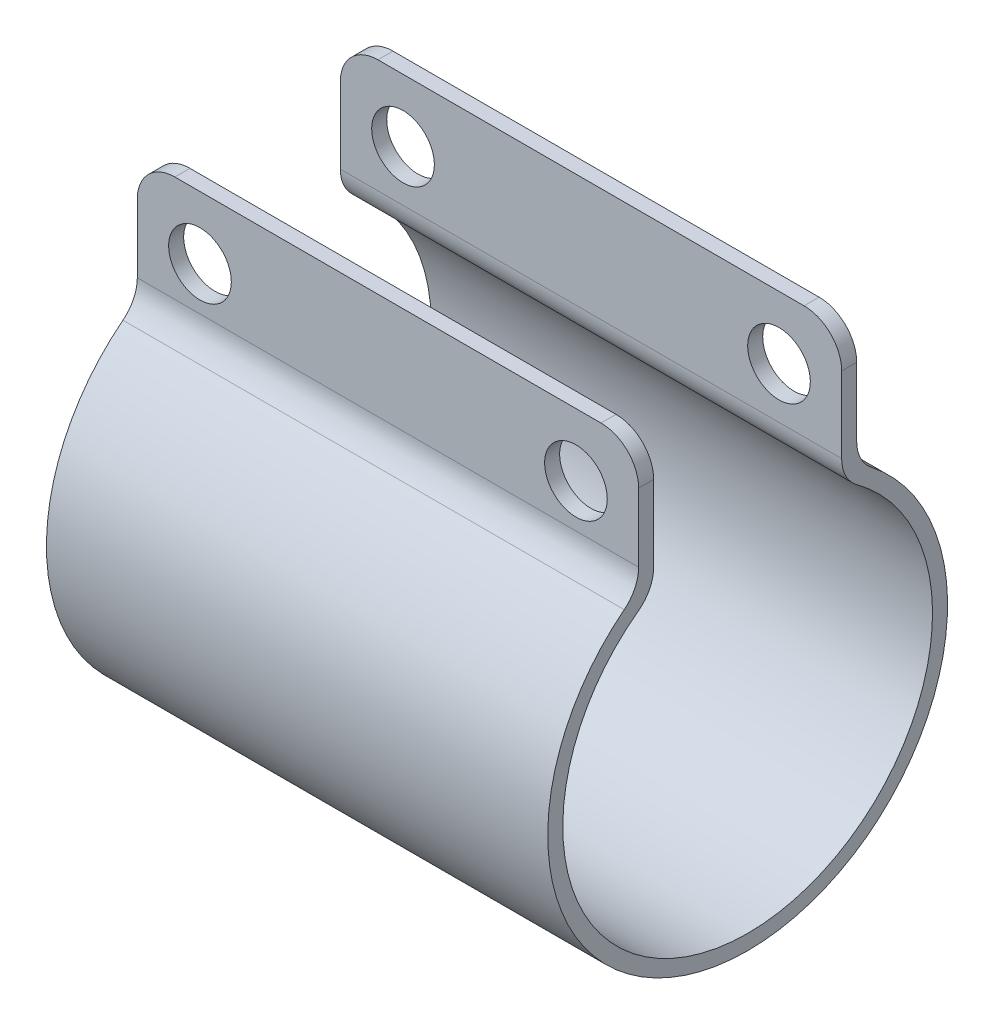
ISO-10303-21;
HEADER;
FILE_DESCRIPTION(('STEP AP214'),'2;1');
FILE_NAME('part.step','',(''),(''),'','','');
FILE_SCHEMA(('AUTOMOTIVE_DESIGN { 1 0 10303 214 1 1 1 1 }'));
ENDSEC;
DATA;
#1=APPLICATION_CONTEXT('core data for automotive mechanical design processes');
#2=APPLICATION_PROTOCOL_DEFINITION('international standard','automotive_design',2000,#1);
#3=PRODUCT_CONTEXT('',#1,'mechanical');
#4=PRODUCT('Part','Part','',(#3));
#5=PRODUCT_RELATED_PRODUCT_CATEGORY('part','',(#4));
#6=PRODUCT_DEFINITION_FORMATION('','',#4);
#7=PRODUCT_DEFINITION_CONTEXT('part definition',#1,'design');
#8=PRODUCT_DEFINITION('design','',#6,#7);
#9=PRODUCT_DEFINITION_SHAPE('','',#8);
#10=(LENGTH_UNIT() NAMED_UNIT(*) SI_UNIT(.MILLI.,.METRE.));
#11=(NAMED_UNIT(*) PLANE_ANGLE_UNIT() SI_UNIT($,.RADIAN.));
#12=(NAMED_UNIT(*) SI_UNIT($,.STERADIAN.) SOLID_ANGLE_UNIT());
#13=UNCERTAINTY_MEASURE_WITH_UNIT(LENGTH_MEASURE(1.E-05),#10,'distance_accuracy_value','');
#14=(GEOMETRIC_REPRESENTATION_CONTEXT(3) GLOBAL_UNCERTAINTY_ASSIGNED_CONTEXT((#13)) GLOBAL_UNIT_ASSIGNED_CONTEXT((#10,
#11,#12)) REPRESENTATION_CONTEXT('',''));
#15=CARTESIAN_POINT('',(0.,0.,0.));
#16=DIRECTION('',(0.,0.,1.));
#17=DIRECTION('',(1.,0.,0.));
#18=AXIS2_PLACEMENT_3D('',#15,#16,#17);
#19=CARTESIAN_POINT('',(50.8,0.,0.));
#20=DIRECTION('',(-1.,0.,0.));
#21=DIRECTION('',(0.,0.,1.));
#22=AXIS2_PLACEMENT_3D('',#19,#20,#21);
#23=CYLINDRICAL_SURFACE('',#22,18.7325);
#24=CARTESIAN_POINT('',(0.,0.,0.));
#25=DIRECTION('',(-1.,0.,0.));
#26=DIRECTION('',(0.,0.,-1.));
#27=AXIS2_PLACEMENT_3D('',#24,#25,#26);
#28=CIRCLE('',#27,18.7325);
#29=CARTESIAN_POINT('',(0.,15.1034309095413,-11.0811971830986));
#30=VERTEX_POINT('',#29);
#31=CARTESIAN_POINT('',(0.,15.1034309095413,11.0811971830986));
#32=VERTEX_POINT('',#31);
#33=EDGE_CURVE('E289',#30,#32,#28,.T.);
#34=ORIENTED_EDGE('',*,*,#33,.T.);
#35=DIRECTION('',(-1.,0.,0.));
#36=VECTOR('',#35,1.);
#37=CARTESIAN_POINT('',(50.8,15.1034309095413,11.0811971830986));
#38=LINE('',#37,#36);
#39=CARTESIAN_POINT('',(50.8,15.1034309095413,11.0811971830986));
#40=VERTEX_POINT('',#39);
#41=EDGE_CURVE('E164',#32,#40,#38,.F.);
#42=ORIENTED_EDGE('',*,*,#41,.T.);
#43=CARTESIAN_POINT('',(50.8,0.,0.));
#44=DIRECTION('',(-1.,0.,0.));
#45=DIRECTION('',(0.,0.,-1.));
#46=AXIS2_PLACEMENT_3D('',#43,#44,#45);
#47=CIRCLE('',#46,18.7325);
#48=CARTESIAN_POINT('',(50.8,15.1034309095413,-11.0811971830986));
#49=VERTEX_POINT('',#48);
#50=EDGE_CURVE('E192',#49,#40,#47,.T.);
#51=ORIENTED_EDGE('',*,*,#50,.F.);
#52=DIRECTION('',(-1.,0.,0.));
#53=VECTOR('',#52,1.);
#54=CARTESIAN_POINT('',(50.8,15.1034309095413,-11.0811971830986));
#55=LINE('',#54,#53);
#56=EDGE_CURVE('E266',#49,#30,#55,.T.);
#57=ORIENTED_EDGE('',*,*,#56,.T.);
#58=EDGE_LOOP('',(#34,#42,#51,#57));
#59=FACE_BOUND('',#58,.T.);
#60=ADVANCED_FACE('F40',(#59),#23,.F.);
#61=CARTESIAN_POINT('',(50.8,16.1301249607683,9.525));
#62=DIRECTION('',(0.,0.,1.));
#63=DIRECTION('',(1.,0.,0.));
#64=AXIS2_PLACEMENT_3D('',#61,#62,#63);
#65=PLANE('',#64);
#66=CARTESIAN_POINT('',(6.35,23.3277911181049,9.525));
#67=DIRECTION('',(0.,0.,1.));
#68=DIRECTION('',(1.,0.,0.));
#69=AXIS2_PLACEMENT_3D('',#66,#67,#68);
#70=CIRCLE('',#69,3.175);
#71=CARTESIAN_POINT('',(9.525,23.3277911181049,9.525));
#72=VERTEX_POINT('',#71);
#73=EDGE_CURVE('E290',#72,#72,#70,.T.);
#74=ORIENTED_EDGE('',*,*,#73,.T.);
#75=EDGE_LOOP('',(#74));
#76=FACE_BOUND('',#75,.T.);
#77=CARTESIAN_POINT('',(44.45,23.3277911181049,9.525));
#78=DIRECTION('',(0.,0.,1.));
#79=DIRECTION('',(1.,0.,0.));
#80=AXIS2_PLACEMENT_3D('',#77,#78,#79);
#81=CIRCLE('',#80,3.175);
#82=CARTESIAN_POINT('',(47.625,23.3277911181049,9.525));
#83=VERTEX_POINT('',#82);
#84=EDGE_CURVE('E214',#83,#83,#81,.T.);
#85=ORIENTED_EDGE('',*,*,#84,.T.);
#86=EDGE_LOOP('',(#85));
#87=FACE_BOUND('',#86,.T.);
#88=DIRECTION('',(-1.,0.,0.));
#89=VECTOR('',#88,1.);
#90=CARTESIAN_POINT('',(50.8,29.6777911181048,9.525));
#91=LINE('',#90,#89);
#92=CARTESIAN_POINT('',(46.99,29.6777911181048,9.525));
#93=VERTEX_POINT('',#92);
#94=CARTESIAN_POINT('',(3.81,29.6777911181048,9.525));
#95=VERTEX_POINT('',#94);
#96=EDGE_CURVE('E203',#93,#95,#91,.T.);
#97=ORIENTED_EDGE('',*,*,#96,.F.);
#98=CARTESIAN_POINT('',(46.99,25.8677911181049,9.525));
#99=DIRECTION('',(0.,0.,1.));
#100=DIRECTION('',(1.,0.,0.));
#101=AXIS2_PLACEMENT_3D('',#98,#99,#100);
#102=CIRCLE('',#101,3.81);
#103=CARTESIAN_POINT('',(50.8,25.8677911181049,9.525));
#104=VERTEX_POINT('',#103);
#105=EDGE_CURVE('E247',#93,#104,#102,.F.);
#106=ORIENTED_EDGE('',*,*,#105,.T.);
#107=DIRECTION('',(0.,1.,0.));
#108=VECTOR('',#107,1.);
#109=CARTESIAN_POINT('',(50.8,16.1301249607683,9.525));
#110=LINE('',#109,#108);
#111=CARTESIAN_POINT('',(50.8,18.1753151623294,9.525));
#112=VERTEX_POINT('',#111);
#113=EDGE_CURVE('E278',#112,#104,#110,.T.);
#114=ORIENTED_EDGE('',*,*,#113,.F.);
#115=DIRECTION('',(-1.,0.,0.));
#116=VECTOR('',#115,1.);
#117=CARTESIAN_POINT('',(50.8,18.1753151623294,9.525));
#118=LINE('',#117,#116);
#119=CARTESIAN_POINT('',(0.,18.1753151623294,9.525));
#120=VERTEX_POINT('',#119);
#121=EDGE_CURVE('E242',#112,#120,#118,.T.);
#122=ORIENTED_EDGE('',*,*,#121,.T.);
#123=DIRECTION('',(0.,1.,0.));
#124=VECTOR('',#123,1.);
#125=CARTESIAN_POINT('',(0.,16.1301249607683,9.525));
#126=LINE('',#125,#124);
#127=CARTESIAN_POINT('',(0.,25.8677911181049,9.525));
#128=VERTEX_POINT('',#127);
#129=EDGE_CURVE('E186',#120,#128,#126,.T.);
#130=ORIENTED_EDGE('',*,*,#129,.T.);
#131=CARTESIAN_POINT('',(3.81,25.8677911181049,9.525));
#132=DIRECTION('',(0.,0.,1.));
#133=DIRECTION('',(1.,0.,0.));
#134=AXIS2_PLACEMENT_3D('',#131,#132,#133);
#135=CIRCLE('',#134,3.81);
#136=EDGE_CURVE('E245',#128,#95,#135,.F.);
#137=ORIENTED_EDGE('',*,*,#136,.T.);
#138=EDGE_LOOP('',(#97,#106,#114,#122,#130,#137));
#139=FACE_BOUND('',#138,.T.);
#140=ADVANCED_FACE('F295',(#76,#87,#139),#65,.F.);
#141=CARTESIAN_POINT('',(50.8,29.6777911181048,9.525));
#142=DIRECTION('',(0.,-1.,0.));
#143=DIRECTION('',(0.,0.,-1.));
#144=AXIS2_PLACEMENT_3D('',#141,#142,#143);
#145=PLANE('',#144);
#146=DIRECTION('',(-1.,0.,0.));
#147=VECTOR('',#146,1.);
#148=CARTESIAN_POINT('',(50.8,29.6777911181048,11.049));
#149=LINE('',#148,#147);
#150=CARTESIAN_POINT('',(46.99,29.6777911181048,11.049));
#151=VERTEX_POINT('',#150);
#152=CARTESIAN_POINT('',(3.81,29.6777911181048,11.049));
#153=VERTEX_POINT('',#152);
#154=EDGE_CURVE('E200',#151,#153,#149,.T.);
#155=ORIENTED_EDGE('',*,*,#154,.F.);
#156=DIRECTION('',(0.,0.,1.));
#157=VECTOR('',#156,1.);
#158=CARTESIAN_POINT('',(46.99,29.6777911181048,9.525));
#159=LINE('',#158,#157);
#160=EDGE_CURVE('E240',#151,#93,#159,.F.);
#161=ORIENTED_EDGE('',*,*,#160,.T.);
#162=ORIENTED_EDGE('',*,*,#96,.T.);
#163=DIRECTION('',(0.,0.,1.));
#164=VECTOR('',#163,1.);
#165=CARTESIAN_POINT('',(3.81,29.6777911181048,9.525));
#166=LINE('',#165,#164);
#167=EDGE_CURVE('E237',#95,#153,#166,.T.);
#168=ORIENTED_EDGE('',*,*,#167,.T.);
#169=EDGE_LOOP('',(#155,#161,#162,#168));
#170=FACE_BOUND('',#169,.T.);
#171=ADVANCED_FACE('F304',(#170),#145,.F.);
#172=CARTESIAN_POINT('',(50.8,29.6777911181048,11.049));
#173=DIRECTION('',(0.,0.,-1.));
#174=DIRECTION('',(0.,1.,0.));
#175=AXIS2_PLACEMENT_3D('',#172,#173,#174);
#176=PLANE('',#175);
#177=CARTESIAN_POINT('',(6.35,23.3277911181049,11.049));
#178=DIRECTION('',(0.,0.,-1.));
#179=DIRECTION('',(0.,1.,0.));
#180=AXIS2_PLACEMENT_3D('',#177,#178,#179);
#181=CIRCLE('',#180,3.175);
#182=CARTESIAN_POINT('',(6.35,26.5027911181049,11.049));
#183=VERTEX_POINT('',#182);
#184=EDGE_CURVE('E572',#183,#183,#181,.T.);
#185=ORIENTED_EDGE('',*,*,#184,.T.);
#186=EDGE_LOOP('',(#185));
#187=FACE_BOUND('',#186,.T.);
#188=CARTESIAN_POINT('',(44.45,23.3277911181049,11.049));
#189=DIRECTION('',(0.,0.,-1.));
#190=DIRECTION('',(0.,1.,0.));
#191=AXIS2_PLACEMENT_3D('',#188,#189,#190);
#192=CIRCLE('',#191,3.175);
#193=CARTESIAN_POINT('',(44.45,26.5027911181048,11.049));
#194=VERTEX_POINT('',#193);
#195=EDGE_CURVE('E575',#194,#194,#192,.T.);
#196=ORIENTED_EDGE('',*,*,#195,.T.);
#197=EDGE_LOOP('',(#196));
#198=FACE_BOUND('',#197,.T.);
#199=DIRECTION('',(0.,-1.,0.));
#200=VECTOR('',#199,1.);
#201=CARTESIAN_POINT('',(0.,29.6777911181048,11.049));
#202=LINE('',#201,#200);
#203=CARTESIAN_POINT('',(0.,25.8677911181049,11.049));
#204=VERTEX_POINT('',#203);
#205=CARTESIAN_POINT('',(0.,18.9316280665452,11.049));
#206=VERTEX_POINT('',#205);
#207=EDGE_CURVE('E181',#204,#206,#202,.T.);
#208=ORIENTED_EDGE('',*,*,#207,.T.);
#209=DIRECTION('',(1.,0.,0.));
#210=VECTOR('',#209,1.);
#211=CARTESIAN_POINT('',(50.8,18.9316280665452,11.049));
#212=LINE('',#211,#210);
#213=CARTESIAN_POINT('',(50.8,18.9316280665452,11.049));
#214=VERTEX_POINT('',#213);
#215=EDGE_CURVE('E159',#206,#214,#212,.T.);
#216=ORIENTED_EDGE('',*,*,#215,.T.);
#217=DIRECTION('',(0.,-1.,0.));
#218=VECTOR('',#217,1.);
#219=CARTESIAN_POINT('',(50.8,29.6777911181048,11.049));
#220=LINE('',#219,#218);
#221=CARTESIAN_POINT('',(50.8,25.8677911181049,11.049));
#222=VERTEX_POINT('',#221);
#223=EDGE_CURVE('E275',#222,#214,#220,.T.);
#224=ORIENTED_EDGE('',*,*,#223,.F.);
#225=CARTESIAN_POINT('',(46.99,25.8677911181049,11.049));
#226=DIRECTION('',(0.,0.,-1.));
#227=DIRECTION('',(0.,1.,0.));
#228=AXIS2_PLACEMENT_3D('',#225,#226,#227);
#229=CIRCLE('',#228,3.81);
#230=EDGE_CURVE('E217',#222,#151,#229,.F.);
#231=ORIENTED_EDGE('',*,*,#230,.T.);
#232=ORIENTED_EDGE('',*,*,#154,.T.);
#233=CARTESIAN_POINT('',(3.81,25.8677911181049,11.049));
#234=DIRECTION('',(0.,0.,-1.));
#235=DIRECTION('',(0.,1.,0.));
#236=AXIS2_PLACEMENT_3D('',#233,#234,#235);
#237=CIRCLE('',#236,3.81);
#238=EDGE_CURVE('E174',#153,#204,#237,.F.);
#239=ORIENTED_EDGE('',*,*,#238,.T.);
#240=EDGE_LOOP('',(#208,#216,#224,#231,#232,#239));
#241=FACE_BOUND('',#240,.T.);
#242=ADVANCED_FACE('F306',(#187,#198,#241),#176,.F.);
#243=CARTESIAN_POINT('',(50.8,0.,0.));
#244=DIRECTION('',(-1.,0.,0.));
#245=DIRECTION('',(0.,0.,1.));
#246=AXIS2_PLACEMENT_3D('',#243,#244,#245);
#247=CYLINDRICAL_SURFACE('',#246,20.2565);
#248=CARTESIAN_POINT('',(50.8,0.,0.));
#249=DIRECTION('',(1.,0.,0.));
#250=DIRECTION('',(0.,0.,-1.));
#251=AXIS2_PLACEMENT_3D('',#248,#249,#250);
#252=CIRCLE('',#251,20.2565);
#253=CARTESIAN_POINT('',(50.8,15.9345365520525,12.5066517150396));
#254=VERTEX_POINT('',#253);
#255=CARTESIAN_POINT('',(50.8,15.9345365520525,-12.5066517150396));
#256=VERTEX_POINT('',#255);
#257=EDGE_CURVE('E173',#254,#256,#252,.T.);
#258=ORIENTED_EDGE('',*,*,#257,.F.);
#259=DIRECTION('',(-1.,0.,0.));
#260=VECTOR('',#259,1.);
#261=CARTESIAN_POINT('',(50.8,15.9345365520525,12.5066517150396));
#262=LINE('',#261,#260);
#263=CARTESIAN_POINT('',(0.,15.9345365520525,12.5066517150396));
#264=VERTEX_POINT('',#263);
#265=EDGE_CURVE('E158',#254,#264,#262,.T.);
#266=ORIENTED_EDGE('',*,*,#265,.T.);
#267=CARTESIAN_POINT('',(0.,0.,0.));
#268=DIRECTION('',(1.,0.,0.));
#269=DIRECTION('',(0.,0.,-1.));
#270=AXIS2_PLACEMENT_3D('',#267,#268,#269);
#271=CIRCLE('',#270,20.2565);
#272=CARTESIAN_POINT('',(0.,15.9345365520525,-12.5066517150396));
#273=VERTEX_POINT('',#272);
#274=EDGE_CURVE('E170',#264,#273,#271,.T.);
#275=ORIENTED_EDGE('',*,*,#274,.T.);
#276=DIRECTION('',(-1.,0.,0.));
#277=VECTOR('',#276,1.);
#278=CARTESIAN_POINT('',(50.8,15.9345365520525,-12.5066517150396));
#279=LINE('',#278,#277);
#280=EDGE_CURVE('E175',#273,#256,#279,.F.);
#281=ORIENTED_EDGE('',*,*,#280,.T.);
#282=EDGE_LOOP('',(#258,#266,#275,#281));
#283=FACE_BOUND('',#282,.T.);
#284=ADVANCED_FACE('F169',(#283),#247,.T.);
#285=CARTESIAN_POINT('',(50.8,29.6777911181048,-11.049));
#286=DIRECTION('',(0.,0.,1.));
#287=DIRECTION('',(0.,-1.,0.));
#288=AXIS2_PLACEMENT_3D('',#285,#286,#287);
#289=PLANE('',#288);
#290=CARTESIAN_POINT('',(6.35,23.3277911181049,-11.049));
#291=DIRECTION('',(0.,0.,1.));
#292=DIRECTION('',(0.,-1.,0.));
#293=AXIS2_PLACEMENT_3D('',#290,#291,#292);
#294=CIRCLE('',#293,3.175);
#295=CARTESIAN_POINT('',(6.35,20.1527911181049,-11.049));
#296=VERTEX_POINT('',#295);
#297=EDGE_CURVE('E213',#296,#296,#294,.T.);
#298=ORIENTED_EDGE('',*,*,#297,.T.);
#299=EDGE_LOOP('',(#298));
#300=FACE_BOUND('',#299,.T.);
#301=CARTESIAN_POINT('',(44.45,23.3277911181049,-11.049));
#302=DIRECTION('',(0.,0.,1.));
#303=DIRECTION('',(0.,-1.,0.));
#304=AXIS2_PLACEMENT_3D('',#301,#302,#303);
#305=CIRCLE('',#304,3.175);
#306=CARTESIAN_POINT('',(44.45,20.1527911181049,-11.049));
#307=VERTEX_POINT('',#306);
#308=EDGE_CURVE('E209',#307,#307,#305,.T.);
#309=ORIENTED_EDGE('',*,*,#308,.T.);
#310=EDGE_LOOP('',(#309));
#311=FACE_BOUND('',#310,.T.);
#312=DIRECTION('',(0.,1.,0.));
#313=VECTOR('',#312,1.);
#314=CARTESIAN_POINT('',(50.8,29.6777911181048,-11.049));
#315=LINE('',#314,#313);
#316=CARTESIAN_POINT('',(50.8,18.9316280665452,-11.049));
#317=VERTEX_POINT('',#316);
#318=CARTESIAN_POINT('',(50.8,25.8677911181049,-11.049));
#319=VERTEX_POINT('',#318);
#320=EDGE_CURVE('E280',#317,#319,#315,.T.);
#321=ORIENTED_EDGE('',*,*,#320,.F.);
#322=DIRECTION('',(1.,0.,0.));
#323=VECTOR('',#322,1.);
#324=CARTESIAN_POINT('',(0.,18.9316280665452,-11.049));
#325=LINE('',#324,#323);
#326=CARTESIAN_POINT('',(0.,18.9316280665452,-11.049));
#327=VERTEX_POINT('',#326);
#328=EDGE_CURVE('E224',#317,#327,#325,.F.);
#329=ORIENTED_EDGE('',*,*,#328,.T.);
#330=DIRECTION('',(0.,1.,0.));
#331=VECTOR('',#330,1.);
#332=CARTESIAN_POINT('',(0.,29.6777911181048,-11.049));
#333=LINE('',#332,#331);
#334=CARTESIAN_POINT('',(0.,25.8677911181049,-11.049));
#335=VERTEX_POINT('',#334);
#336=EDGE_CURVE('E180',#327,#335,#333,.T.);
#337=ORIENTED_EDGE('',*,*,#336,.T.);
#338=CARTESIAN_POINT('',(3.81,25.8677911181049,-11.049));
#339=DIRECTION('',(0.,0.,1.));
#340=DIRECTION('',(0.,-1.,0.));
#341=AXIS2_PLACEMENT_3D('',#338,#339,#340);
#342=CIRCLE('',#341,3.81);
#343=CARTESIAN_POINT('',(3.81,29.6777911181048,-11.049));
#344=VERTEX_POINT('',#343);
#345=EDGE_CURVE('E220',#335,#344,#342,.F.);
#346=ORIENTED_EDGE('',*,*,#345,.T.);
#347=DIRECTION('',(-1.,0.,0.));
#348=VECTOR('',#347,1.);
#349=CARTESIAN_POINT('',(50.8,29.6777911181048,-11.049));
#350=LINE('',#349,#348);
#351=CARTESIAN_POINT('',(46.99,29.6777911181048,-11.049));
#352=VERTEX_POINT('',#351);
#353=EDGE_CURVE('E196',#352,#344,#350,.T.);
#354=ORIENTED_EDGE('',*,*,#353,.F.);
#355=CARTESIAN_POINT('',(46.99,25.8677911181049,-11.049));
#356=DIRECTION('',(0.,0.,1.));
#357=DIRECTION('',(0.,-1.,0.));
#358=AXIS2_PLACEMENT_3D('',#355,#356,#357);
#359=CIRCLE('',#358,3.81);
#360=EDGE_CURVE('E222',#352,#319,#359,.F.);
#361=ORIENTED_EDGE('',*,*,#360,.T.);
#362=EDGE_LOOP('',(#321,#329,#337,#346,#354,#361));
#363=FACE_BOUND('',#362,.T.);
#364=ADVANCED_FACE('F334',(#300,#311,#363),#289,.F.);
#365=CARTESIAN_POINT('',(50.8,29.6777911181048,-9.525));
#366=DIRECTION('',(0.,-1.,0.));
#367=DIRECTION('',(0.,0.,-1.));
#368=AXIS2_PLACEMENT_3D('',#365,#366,#367);
#369=PLANE('',#368);
#370=DIRECTION('',(-1.,0.,0.));
#371=VECTOR('',#370,1.);
#372=CARTESIAN_POINT('',(50.8,29.6777911181048,-9.525));
#373=LINE('',#372,#371);
#374=CARTESIAN_POINT('',(46.99,29.6777911181048,-9.525));
#375=VERTEX_POINT('',#374);
#376=CARTESIAN_POINT('',(3.81,29.6777911181048,-9.525));
#377=VERTEX_POINT('',#376);
#378=EDGE_CURVE('E193',#375,#377,#373,.T.);
#379=ORIENTED_EDGE('',*,*,#378,.F.);
#380=DIRECTION('',(0.,0.,1.));
#381=VECTOR('',#380,1.);
#382=CARTESIAN_POINT('',(46.99,29.6777911181048,-11.049));
#383=LINE('',#382,#381);
#384=EDGE_CURVE('E258',#375,#352,#383,.F.);
#385=ORIENTED_EDGE('',*,*,#384,.T.);
#386=ORIENTED_EDGE('',*,*,#353,.T.);
#387=DIRECTION('',(0.,0.,1.));
#388=VECTOR('',#387,1.);
#389=CARTESIAN_POINT('',(3.81,29.6777911181048,-9.525));
#390=LINE('',#389,#388);
#391=EDGE_CURVE('E255',#344,#377,#390,.T.);
#392=ORIENTED_EDGE('',*,*,#391,.T.);
#393=EDGE_LOOP('',(#379,#385,#386,#392));
#394=FACE_BOUND('',#393,.T.);
#395=ADVANCED_FACE('F327',(#394),#369,.F.);
#396=CARTESIAN_POINT('',(50.8,16.1301249607683,-9.525));
#397=DIRECTION('',(0.,0.,-1.));
#398=DIRECTION('',(-1.,0.,0.));
#399=AXIS2_PLACEMENT_3D('',#396,#397,#398);
#400=PLANE('',#399);
#401=CARTESIAN_POINT('',(6.35,23.3277911181049,-9.525));
#402=DIRECTION('',(0.,0.,-1.));
#403=DIRECTION('',(-1.,0.,0.));
#404=AXIS2_PLACEMENT_3D('',#401,#402,#403);
#405=CIRCLE('',#404,3.175);
#406=CARTESIAN_POINT('',(3.175,23.3277911181049,-9.525));
#407=VERTEX_POINT('',#406);
#408=EDGE_CURVE('E210',#407,#407,#405,.T.);
#409=ORIENTED_EDGE('',*,*,#408,.T.);
#410=EDGE_LOOP('',(#409));
#411=FACE_BOUND('',#410,.T.);
#412=CARTESIAN_POINT('',(44.45,23.3277911181049,-9.525));
#413=DIRECTION('',(0.,0.,-1.));
#414=DIRECTION('',(-1.,0.,0.));
#415=AXIS2_PLACEMENT_3D('',#412,#413,#414);
#416=CIRCLE('',#415,3.175);
#417=CARTESIAN_POINT('',(41.275,23.3277911181049,-9.525));
#418=VERTEX_POINT('',#417);
#419=EDGE_CURVE('E206',#418,#418,#416,.T.);
#420=ORIENTED_EDGE('',*,*,#419,.T.);
#421=EDGE_LOOP('',(#420));
#422=FACE_BOUND('',#421,.T.);
#423=DIRECTION('',(0.,-1.,0.));
#424=VECTOR('',#423,1.);
#425=CARTESIAN_POINT('',(50.8,16.1301249607683,-9.525));
#426=LINE('',#425,#424);
#427=CARTESIAN_POINT('',(50.8,25.8677911181049,-9.525));
#428=VERTEX_POINT('',#427);
#429=CARTESIAN_POINT('',(50.8,18.1753151623294,-9.525));
#430=VERTEX_POINT('',#429);
#431=EDGE_CURVE('E197',#428,#430,#426,.T.);
#432=ORIENTED_EDGE('',*,*,#431,.F.);
#433=CARTESIAN_POINT('',(46.99,25.8677911181049,-9.525));
#434=DIRECTION('',(0.,0.,-1.));
#435=DIRECTION('',(-1.,0.,0.));
#436=AXIS2_PLACEMENT_3D('',#433,#434,#435);
#437=CIRCLE('',#436,3.81);
#438=EDGE_CURVE('E253',#428,#375,#437,.F.);
#439=ORIENTED_EDGE('',*,*,#438,.T.);
#440=ORIENTED_EDGE('',*,*,#378,.T.);
#441=CARTESIAN_POINT('',(3.81,25.8677911181049,-9.525));
#442=DIRECTION('',(0.,0.,-1.));
#443=DIRECTION('',(-1.,0.,0.));
#444=AXIS2_PLACEMENT_3D('',#441,#442,#443);
#445=CIRCLE('',#444,3.81);
#446=CARTESIAN_POINT('',(0.,25.8677911181049,-9.525));
#447=VERTEX_POINT('',#446);
#448=EDGE_CURVE('E251',#377,#447,#445,.F.);
#449=ORIENTED_EDGE('',*,*,#448,.T.);
#450=DIRECTION('',(0.,-1.,0.));
#451=VECTOR('',#450,1.);
#452=CARTESIAN_POINT('',(0.,16.1301249607683,-9.525));
#453=LINE('',#452,#451);
#454=CARTESIAN_POINT('',(0.,18.1753151623294,-9.525));
#455=VERTEX_POINT('',#454);
#456=EDGE_CURVE('E184',#447,#455,#453,.T.);
#457=ORIENTED_EDGE('',*,*,#456,.T.);
#458=DIRECTION('',(-1.,0.,0.));
#459=VECTOR('',#458,1.);
#460=CARTESIAN_POINT('',(50.8,18.1753151623294,-9.525));
#461=LINE('',#460,#459);
#462=EDGE_CURVE('E249',#455,#430,#461,.F.);
#463=ORIENTED_EDGE('',*,*,#462,.T.);
#464=EDGE_LOOP('',(#432,#439,#440,#449,#457,#463));
#465=FACE_BOUND('',#464,.T.);
#466=ADVANCED_FACE('F320',(#411,#422,#465),#400,.F.);
#467=CARTESIAN_POINT('',(50.8,0.,0.));
#468=DIRECTION('',(1.,0.,0.));
#469=DIRECTION('',(0.,0.,-1.));
#470=AXIS2_PLACEMENT_3D('',#467,#468,#469);
#471=PLANE('',#470);
#472=ORIENTED_EDGE('',*,*,#113,.T.);
#473=DIRECTION('',(0.,0.,1.));
#474=VECTOR('',#473,1.);
#475=CARTESIAN_POINT('',(50.8,25.8677911181049,11.049));
#476=LINE('',#475,#474);
#477=EDGE_CURVE('E234',#104,#222,#476,.T.);
#478=ORIENTED_EDGE('',*,*,#477,.T.);
#479=ORIENTED_EDGE('',*,*,#223,.T.);
#480=CARTESIAN_POINT('',(50.8,18.9316280665452,14.859));
#481=DIRECTION('',(1.,0.,0.));
#482=DIRECTION('',(0.,0.,-1.));
#483=AXIS2_PLACEMENT_3D('',#480,#481,#482);
#484=CIRCLE('',#483,3.81);
#485=EDGE_CURVE('E163',#214,#254,#484,.F.);
#486=ORIENTED_EDGE('',*,*,#485,.T.);
#487=ORIENTED_EDGE('',*,*,#257,.T.);
#488=CARTESIAN_POINT('',(50.8,18.9316280665452,-14.859));
#489=DIRECTION('',(1.,0.,0.));
#490=DIRECTION('',(0.,0.,-1.));
#491=AXIS2_PLACEMENT_3D('',#488,#489,#490);
#492=CIRCLE('',#491,3.81);
#493=EDGE_CURVE('E11',#256,#317,#492,.F.);
#494=ORIENTED_EDGE('',*,*,#493,.T.);
#495=ORIENTED_EDGE('',*,*,#320,.T.);
#496=DIRECTION('',(0.,0.,1.));
#497=VECTOR('',#496,1.);
#498=CARTESIAN_POINT('',(50.8,25.8677911181049,-9.525));
#499=LINE('',#498,#497);
#500=EDGE_CURVE('E231',#319,#428,#499,.T.);
#501=ORIENTED_EDGE('',*,*,#500,.T.);
#502=ORIENTED_EDGE('',*,*,#431,.T.);
#503=CARTESIAN_POINT('',(50.8,18.1753151623294,-13.335));
#504=DIRECTION('',(1.,0.,0.));
#505=DIRECTION('',(0.,0.,-1.));
#506=AXIS2_PLACEMENT_3D('',#503,#504,#505);
#507=CIRCLE('',#506,3.81);
#508=EDGE_CURVE('E227',#430,#49,#507,.T.);
#509=ORIENTED_EDGE('',*,*,#508,.T.);
#510=ORIENTED_EDGE('',*,*,#50,.T.);
#511=CARTESIAN_POINT('',(50.8,18.1753151623294,13.335));
#512=DIRECTION('',(1.,0.,0.));
#513=DIRECTION('',(0.,0.,-1.));
#514=AXIS2_PLACEMENT_3D('',#511,#512,#513);
#515=CIRCLE('',#514,3.81);
#516=EDGE_CURVE('E229',#40,#112,#515,.T.);
#517=ORIENTED_EDGE('',*,*,#516,.T.);
#518=EDGE_LOOP('',(#472,#478,#479,#486,#487,#494,#495,#501,#502,#509,#510,#517));
#519=FACE_BOUND('',#518,.T.);
#520=ADVANCED_FACE('F272',(#519),#471,.T.);
#521=CARTESIAN_POINT('',(0.,0.,0.));
#522=DIRECTION('',(1.,0.,0.));
#523=DIRECTION('',(0.,0.,-1.));
#524=AXIS2_PLACEMENT_3D('',#521,#522,#523);
#525=PLANE('',#524);
#526=ORIENTED_EDGE('',*,*,#456,.F.);
#527=DIRECTION('',(0.,0.,1.));
#528=VECTOR('',#527,1.);
#529=CARTESIAN_POINT('',(0.,25.8677911181049,0.));
#530=LINE('',#529,#528);
#531=EDGE_CURVE('E264',#447,#335,#530,.F.);
#532=ORIENTED_EDGE('',*,*,#531,.T.);
#533=ORIENTED_EDGE('',*,*,#336,.F.);
#534=CARTESIAN_POINT('',(0.,18.9316280665452,-14.859));
#535=DIRECTION('',(1.,0.,0.));
#536=DIRECTION('',(0.,0.,-1.));
#537=AXIS2_PLACEMENT_3D('',#534,#535,#536);
#538=CIRCLE('',#537,3.81);
#539=EDGE_CURVE('E48',#327,#273,#538,.T.);
#540=ORIENTED_EDGE('',*,*,#539,.T.);
#541=ORIENTED_EDGE('',*,*,#274,.F.);
#542=CARTESIAN_POINT('',(0.,18.9316280665452,14.859));
#543=DIRECTION('',(1.,0.,0.));
#544=DIRECTION('',(0.,0.,-1.));
#545=AXIS2_PLACEMENT_3D('',#542,#543,#544);
#546=CIRCLE('',#545,3.81);
#547=EDGE_CURVE('E154',#264,#206,#546,.T.);
#548=ORIENTED_EDGE('',*,*,#547,.T.);
#549=ORIENTED_EDGE('',*,*,#207,.F.);
#550=DIRECTION('',(0.,0.,1.));
#551=VECTOR('',#550,1.);
#552=CARTESIAN_POINT('',(0.,25.8677911181049,0.));
#553=LINE('',#552,#551);
#554=EDGE_CURVE('E262',#204,#128,#553,.F.);
#555=ORIENTED_EDGE('',*,*,#554,.T.);
#556=ORIENTED_EDGE('',*,*,#129,.F.);
#557=CARTESIAN_POINT('',(0.,18.1753151623294,13.335));
#558=DIRECTION('',(1.,0.,0.));
#559=DIRECTION('',(0.,0.,-1.));
#560=AXIS2_PLACEMENT_3D('',#557,#558,#559);
#561=CIRCLE('',#560,3.81);
#562=EDGE_CURVE('E55',#120,#32,#561,.F.);
#563=ORIENTED_EDGE('',*,*,#562,.T.);
#564=ORIENTED_EDGE('',*,*,#33,.F.);
#565=CARTESIAN_POINT('',(0.,18.1753151623294,-13.335));
#566=DIRECTION('',(1.,0.,0.));
#567=DIRECTION('',(0.,0.,-1.));
#568=AXIS2_PLACEMENT_3D('',#565,#566,#567);
#569=CIRCLE('',#568,3.81);
#570=EDGE_CURVE('E63',#30,#455,#569,.F.);
#571=ORIENTED_EDGE('',*,*,#570,.T.);
#572=EDGE_LOOP('',(#526,#532,#533,#540,#541,#548,#549,#555,#556,#563,#564,#571));
#573=FACE_BOUND('',#572,.T.);
#574=ADVANCED_FACE('F178',(#573),#525,.F.);
#575=CARTESIAN_POINT('',(44.45,23.3277911181049,-20.2565));
#576=DIRECTION('',(0.,0.,1.));
#577=DIRECTION('',(1.,0.,0.));
#578=AXIS2_PLACEMENT_3D('',#575,#576,#577);
#579=CYLINDRICAL_SURFACE('',#578,3.175);
#580=ORIENTED_EDGE('',*,*,#419,.F.);
#581=EDGE_LOOP('',(#580));
#582=FACE_BOUND('',#581,.T.);
#583=ORIENTED_EDGE('',*,*,#308,.F.);
#584=EDGE_LOOP('',(#583));
#585=FACE_BOUND('',#584,.T.);
#586=ADVANCED_FACE('F443',(#582,#585),#579,.F.);
#587=CARTESIAN_POINT('',(6.35,23.3277911181049,-20.2565));
#588=DIRECTION('',(0.,0.,1.));
#589=DIRECTION('',(1.,0.,0.));
#590=AXIS2_PLACEMENT_3D('',#587,#588,#589);
#591=CYLINDRICAL_SURFACE('',#590,3.175);
#592=ORIENTED_EDGE('',*,*,#408,.F.);
#593=EDGE_LOOP('',(#592));
#594=FACE_BOUND('',#593,.T.);
#595=ORIENTED_EDGE('',*,*,#297,.F.);
#596=EDGE_LOOP('',(#595));
#597=FACE_BOUND('',#596,.T.);
#598=ADVANCED_FACE('F433',(#594,#597),#591,.F.);
#599=ORIENTED_EDGE('',*,*,#195,.F.);
#600=EDGE_LOOP('',(#599));
#601=FACE_BOUND('',#600,.T.);
#602=ORIENTED_EDGE('',*,*,#84,.F.);
#603=EDGE_LOOP('',(#602));
#604=FACE_BOUND('',#603,.T.);
#605=ADVANCED_FACE('F430',(#601,#604),#579,.F.);
#606=ORIENTED_EDGE('',*,*,#184,.F.);
#607=EDGE_LOOP('',(#606));
#608=FACE_BOUND('',#607,.T.);
#609=ORIENTED_EDGE('',*,*,#73,.F.);
#610=EDGE_LOOP('',(#609));
#611=FACE_BOUND('',#610,.T.);
#612=ADVANCED_FACE('F360',(#608,#611),#591,.F.);
#613=CARTESIAN_POINT('',(50.8,18.9316280665452,14.859));
#614=DIRECTION('',(-1.,0.,0.));
#615=DIRECTION('',(0.,0.,1.));
#616=AXIS2_PLACEMENT_3D('',#613,#614,#615);
#617=CYLINDRICAL_SURFACE('',#616,3.81);
#618=ORIENTED_EDGE('',*,*,#485,.F.);
#619=ORIENTED_EDGE('',*,*,#215,.F.);
#620=ORIENTED_EDGE('',*,*,#547,.F.);
#621=ORIENTED_EDGE('',*,*,#265,.F.);
#622=EDGE_LOOP('',(#618,#619,#620,#621));
#623=FACE_BOUND('',#622,.T.);
#624=ADVANCED_FACE('F157',(#623),#617,.F.);
#625=CARTESIAN_POINT('',(50.8,18.9316280665452,-14.859));
#626=DIRECTION('',(-1.,0.,0.));
#627=DIRECTION('',(0.,0.,1.));
#628=AXIS2_PLACEMENT_3D('',#625,#626,#627);
#629=CYLINDRICAL_SURFACE('',#628,3.81);
#630=ORIENTED_EDGE('',*,*,#493,.F.);
#631=ORIENTED_EDGE('',*,*,#280,.F.);
#632=ORIENTED_EDGE('',*,*,#539,.F.);
#633=ORIENTED_EDGE('',*,*,#328,.F.);
#634=EDGE_LOOP('',(#630,#631,#632,#633));
#635=FACE_BOUND('',#634,.T.);
#636=ADVANCED_FACE('F337',(#635),#629,.F.);
#637=CARTESIAN_POINT('',(46.99,25.8677911181049,0.));
#638=DIRECTION('',(0.,0.,-1.));
#639=DIRECTION('',(-1.,0.,0.));
#640=AXIS2_PLACEMENT_3D('',#637,#638,#639);
#641=CYLINDRICAL_SURFACE('',#640,3.81);
#642=ORIENTED_EDGE('',*,*,#105,.F.);
#643=ORIENTED_EDGE('',*,*,#160,.F.);
#644=ORIENTED_EDGE('',*,*,#230,.F.);
#645=ORIENTED_EDGE('',*,*,#477,.F.);
#646=EDGE_LOOP('',(#642,#643,#644,#645));
#647=FACE_BOUND('',#646,.T.);
#648=ADVANCED_FACE('F309',(#647),#641,.T.);
#649=CARTESIAN_POINT('',(46.99,25.8677911181049,0.));
#650=DIRECTION('',(0.,0.,-1.));
#651=DIRECTION('',(-1.,0.,0.));
#652=AXIS2_PLACEMENT_3D('',#649,#650,#651);
#653=CYLINDRICAL_SURFACE('',#652,3.81);
#654=ORIENTED_EDGE('',*,*,#360,.F.);
#655=ORIENTED_EDGE('',*,*,#384,.F.);
#656=ORIENTED_EDGE('',*,*,#438,.F.);
#657=ORIENTED_EDGE('',*,*,#500,.F.);
#658=EDGE_LOOP('',(#654,#655,#656,#657));
#659=FACE_BOUND('',#658,.T.);
#660=ADVANCED_FACE('F331',(#659),#653,.T.);
#661=CARTESIAN_POINT('',(3.81,25.8677911181049,-9.525));
#662=DIRECTION('',(0.,0.,1.));
#663=DIRECTION('',(1.,0.,0.));
#664=AXIS2_PLACEMENT_3D('',#661,#662,#663);
#665=CYLINDRICAL_SURFACE('',#664,3.81);
#666=ORIENTED_EDGE('',*,*,#345,.F.);
#667=ORIENTED_EDGE('',*,*,#531,.F.);
#668=ORIENTED_EDGE('',*,*,#448,.F.);
#669=ORIENTED_EDGE('',*,*,#391,.F.);
#670=EDGE_LOOP('',(#666,#667,#668,#669));
#671=FACE_BOUND('',#670,.T.);
#672=ADVANCED_FACE('F340',(#671),#665,.T.);
#673=CARTESIAN_POINT('',(3.81,25.8677911181049,9.525));
#674=DIRECTION('',(0.,0.,1.));
#675=DIRECTION('',(1.,0.,0.));
#676=AXIS2_PLACEMENT_3D('',#673,#674,#675);
#677=CYLINDRICAL_SURFACE('',#676,3.81);
#678=ORIENTED_EDGE('',*,*,#136,.F.);
#679=ORIENTED_EDGE('',*,*,#554,.F.);
#680=ORIENTED_EDGE('',*,*,#238,.F.);
#681=ORIENTED_EDGE('',*,*,#167,.F.);
#682=EDGE_LOOP('',(#678,#679,#680,#681));
#683=FACE_BOUND('',#682,.T.);
#684=ADVANCED_FACE('F301',(#683),#677,.T.);
#685=CARTESIAN_POINT('',(50.8,18.1753151623294,13.335));
#686=DIRECTION('',(-1.,0.,0.));
#687=DIRECTION('',(0.,0.,1.));
#688=AXIS2_PLACEMENT_3D('',#685,#686,#687);
#689=CYLINDRICAL_SURFACE('',#688,3.81);
#690=ORIENTED_EDGE('',*,*,#516,.F.);
#691=ORIENTED_EDGE('',*,*,#41,.F.);
#692=ORIENTED_EDGE('',*,*,#562,.F.);
#693=ORIENTED_EDGE('',*,*,#121,.F.);
#694=EDGE_LOOP('',(#690,#691,#692,#693));
#695=FACE_BOUND('',#694,.T.);
#696=ADVANCED_FACE('F315',(#695),#689,.T.);
#697=CARTESIAN_POINT('',(50.8,18.1753151623294,-13.335));
#698=DIRECTION('',(-1.,0.,0.));
#699=DIRECTION('',(0.,0.,1.));
#700=AXIS2_PLACEMENT_3D('',#697,#698,#699);
#701=CYLINDRICAL_SURFACE('',#700,3.81);
#702=ORIENTED_EDGE('',*,*,#508,.F.);
#703=ORIENTED_EDGE('',*,*,#462,.F.);
#704=ORIENTED_EDGE('',*,*,#570,.F.);
#705=ORIENTED_EDGE('',*,*,#56,.F.);
#706=EDGE_LOOP('',(#702,#703,#704,#705));
#707=FACE_BOUND('',#706,.T.);
#708=ADVANCED_FACE('F42',(#707),#701,.T.);
#709=CLOSED_SHELL('',(#60,#140,#171,#242,#284,#364,#395,#466,#520,#574,#586,#598,#605,#612,#624,
#636,#648,#660,#672,#684,#696,#708));
#710=MANIFOLD_SOLID_BREP('B2',#709);
#711=ADVANCED_BREP_SHAPE_REPRESENTATION('',(#18,#710),#14);
#712=SHAPE_DEFINITION_REPRESENTATION(#9,#711);
ENDSEC;
END-ISO-10303-21;
